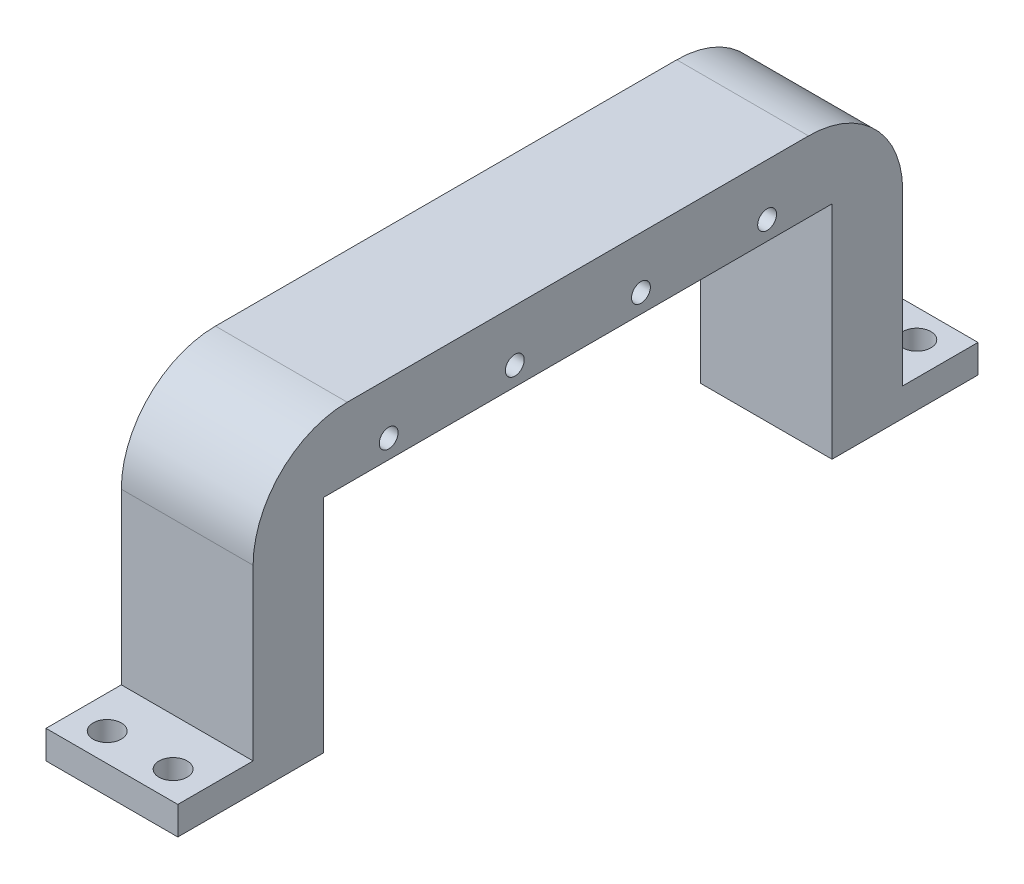
ISO-10303-21;
HEADER;
FILE_DESCRIPTION(('STEP AP214'),'2;1');
FILE_NAME('part.step','',(''),(''),'','','');
FILE_SCHEMA(('AUTOMOTIVE_DESIGN { 1 0 10303 214 1 1 1 1 }'));
ENDSEC;
DATA;
#1=APPLICATION_CONTEXT('core data for automotive mechanical design processes');
#2=APPLICATION_PROTOCOL_DEFINITION('international standard','automotive_design',2000,#1);
#3=PRODUCT_CONTEXT('',#1,'mechanical');
#4=PRODUCT('Part','Part','',(#3));
#5=PRODUCT_RELATED_PRODUCT_CATEGORY('part','',(#4));
#6=PRODUCT_DEFINITION_FORMATION('','',#4);
#7=PRODUCT_DEFINITION_CONTEXT('part definition',#1,'design');
#8=PRODUCT_DEFINITION('design','',#6,#7);
#9=PRODUCT_DEFINITION_SHAPE('','',#8);
#10=(LENGTH_UNIT() NAMED_UNIT(*) SI_UNIT(.MILLI.,.METRE.));
#11=(NAMED_UNIT(*) PLANE_ANGLE_UNIT() SI_UNIT($,.RADIAN.));
#12=(NAMED_UNIT(*) SI_UNIT($,.STERADIAN.) SOLID_ANGLE_UNIT());
#13=UNCERTAINTY_MEASURE_WITH_UNIT(LENGTH_MEASURE(1.E-05),#10,'distance_accuracy_value','');
#14=(GEOMETRIC_REPRESENTATION_CONTEXT(3) GLOBAL_UNCERTAINTY_ASSIGNED_CONTEXT((#13)) GLOBAL_UNIT_ASSIGNED_CONTEXT((#10,
#11,#12)) REPRESENTATION_CONTEXT('',''));
#15=CARTESIAN_POINT('',(0.,0.,0.));
#16=DIRECTION('',(0.,0.,1.));
#17=DIRECTION('',(1.,0.,0.));
#18=AXIS2_PLACEMENT_3D('',#15,#16,#17);
#19=CARTESIAN_POINT('',(-7.,0.,-27.));
#20=DIRECTION('',(0.,0.,1.));
#21=DIRECTION('',(0.,-1.,0.));
#22=AXIS2_PLACEMENT_3D('',#19,#20,#21);
#23=PLANE('',#22);
#24=DIRECTION('',(1.,0.,0.));
#25=VECTOR('',#24,1.);
#26=CARTESIAN_POINT('',(-7.,-23.5,-27.));
#27=LINE('',#26,#25);
#28=CARTESIAN_POINT('',(-7.,-23.5,-27.));
#29=VERTEX_POINT('',#28);
#30=CARTESIAN_POINT('',(7.,-23.5,-27.));
#31=VERTEX_POINT('',#30);
#32=EDGE_CURVE('E190',#29,#31,#27,.T.);
#33=ORIENTED_EDGE('',*,*,#32,.T.);
#34=DIRECTION('',(0.,-1.,0.));
#35=VECTOR('',#34,1.);
#36=CARTESIAN_POINT('',(7.,0.,-27.));
#37=LINE('',#36,#35);
#38=CARTESIAN_POINT('',(7.,0.,-27.));
#39=VERTEX_POINT('',#38);
#40=EDGE_CURVE('E326',#39,#31,#37,.T.);
#41=ORIENTED_EDGE('',*,*,#40,.F.);
#42=DIRECTION('',(1.,0.,0.));
#43=VECTOR('',#42,1.);
#44=CARTESIAN_POINT('',(-7.,0.,-27.));
#45=LINE('',#44,#43);
#46=CARTESIAN_POINT('',(-7.,0.,-27.));
#47=VERTEX_POINT('',#46);
#48=EDGE_CURVE('E191',#47,#39,#45,.T.);
#49=ORIENTED_EDGE('',*,*,#48,.F.);
#50=DIRECTION('',(0.,-1.,0.));
#51=VECTOR('',#50,1.);
#52=CARTESIAN_POINT('',(-7.,0.,-27.));
#53=LINE('',#52,#51);
#54=EDGE_CURVE('E175',#47,#29,#53,.T.);
#55=ORIENTED_EDGE('',*,*,#54,.T.);
#56=EDGE_LOOP('',(#33,#41,#49,#55));
#57=FACE_BOUND('',#56,.T.);
#58=ADVANCED_FACE('F48',(#57),#23,.T.);
#59=CARTESIAN_POINT('',(-7.,0.,27.));
#60=DIRECTION('',(0.,-1.,0.));
#61=DIRECTION('',(0.,0.,-1.));
#62=AXIS2_PLACEMENT_3D('',#59,#60,#61);
#63=PLANE('',#62);
#64=ORIENTED_EDGE('',*,*,#48,.T.);
#65=DIRECTION('',(0.,0.,-1.));
#66=VECTOR('',#65,1.);
#67=CARTESIAN_POINT('',(7.,0.,27.));
#68=LINE('',#67,#66);
#69=CARTESIAN_POINT('',(7.,0.,27.));
#70=VERTEX_POINT('',#69);
#71=EDGE_CURVE('E240',#70,#39,#68,.T.);
#72=ORIENTED_EDGE('',*,*,#71,.F.);
#73=DIRECTION('',(1.,0.,0.));
#74=VECTOR('',#73,1.);
#75=CARTESIAN_POINT('',(-7.,0.,27.));
#76=LINE('',#75,#74);
#77=CARTESIAN_POINT('',(-7.,0.,27.));
#78=VERTEX_POINT('',#77);
#79=EDGE_CURVE('E194',#78,#70,#76,.T.);
#80=ORIENTED_EDGE('',*,*,#79,.F.);
#81=DIRECTION('',(0.,0.,-1.));
#82=VECTOR('',#81,1.);
#83=CARTESIAN_POINT('',(-7.,0.,27.));
#84=LINE('',#83,#82);
#85=EDGE_CURVE('E187',#78,#47,#84,.T.);
#86=ORIENTED_EDGE('',*,*,#85,.T.);
#87=EDGE_LOOP('',(#64,#72,#80,#86));
#88=FACE_BOUND('',#87,.T.);
#89=ADVANCED_FACE('F251',(#88),#63,.T.);
#90=CARTESIAN_POINT('',(-7.,0.,27.));
#91=DIRECTION('',(0.,0.,-1.));
#92=DIRECTION('',(0.,1.,0.));
#93=AXIS2_PLACEMENT_3D('',#90,#91,#92);
#94=PLANE('',#93);
#95=ORIENTED_EDGE('',*,*,#79,.T.);
#96=DIRECTION('',(0.,1.,0.));
#97=VECTOR('',#96,1.);
#98=CARTESIAN_POINT('',(7.,0.,27.));
#99=LINE('',#98,#97);
#100=CARTESIAN_POINT('',(7.,-23.5,27.));
#101=VERTEX_POINT('',#100);
#102=EDGE_CURVE('E233',#101,#70,#99,.T.);
#103=ORIENTED_EDGE('',*,*,#102,.F.);
#104=DIRECTION('',(1.,0.,0.));
#105=VECTOR('',#104,1.);
#106=CARTESIAN_POINT('',(-7.,-23.5,27.));
#107=LINE('',#106,#105);
#108=CARTESIAN_POINT('',(-7.,-23.5,27.));
#109=VERTEX_POINT('',#108);
#110=EDGE_CURVE('E196',#109,#101,#107,.T.);
#111=ORIENTED_EDGE('',*,*,#110,.F.);
#112=DIRECTION('',(0.,1.,0.));
#113=VECTOR('',#112,1.);
#114=CARTESIAN_POINT('',(-7.,0.,27.));
#115=LINE('',#114,#113);
#116=EDGE_CURVE('E184',#109,#78,#115,.T.);
#117=ORIENTED_EDGE('',*,*,#116,.T.);
#118=EDGE_LOOP('',(#95,#103,#111,#117));
#119=FACE_BOUND('',#118,.T.);
#120=ADVANCED_FACE('F255',(#119),#94,.T.);
#121=CARTESIAN_POINT('',(-7.,-23.5,27.));
#122=DIRECTION('',(0.,-1.,0.));
#123=DIRECTION('',(0.,0.,-1.));
#124=AXIS2_PLACEMENT_3D('',#121,#122,#123);
#125=PLANE('',#124);
#126=CARTESIAN_POINT('',(-3.5,-23.5,30.75));
#127=DIRECTION('',(0.,-1.,0.));
#128=DIRECTION('',(0.,0.,1.));
#129=AXIS2_PLACEMENT_3D('',#126,#127,#128);
#130=CIRCLE('',#129,1.5);
#131=CARTESIAN_POINT('',(-3.5,-23.5,32.25));
#132=VERTEX_POINT('',#131);
#133=EDGE_CURVE('E284',#132,#132,#130,.T.);
#134=ORIENTED_EDGE('',*,*,#133,.F.);
#135=EDGE_LOOP('',(#134));
#136=FACE_BOUND('',#135,.T.);
#137=CARTESIAN_POINT('',(3.5,-23.5,30.75));
#138=DIRECTION('',(0.,-1.,0.));
#139=DIRECTION('',(0.,0.,-1.));
#140=AXIS2_PLACEMENT_3D('',#137,#138,#139);
#141=CIRCLE('',#140,1.5);
#142=CARTESIAN_POINT('',(3.5,-23.5,29.25));
#143=VERTEX_POINT('',#142);
#144=EDGE_CURVE('E278',#143,#143,#141,.T.);
#145=ORIENTED_EDGE('',*,*,#144,.F.);
#146=EDGE_LOOP('',(#145));
#147=FACE_BOUND('',#146,.T.);
#148=ORIENTED_EDGE('',*,*,#110,.T.);
#149=DIRECTION('',(0.,0.,-1.));
#150=VECTOR('',#149,1.);
#151=CARTESIAN_POINT('',(7.,-23.5,27.));
#152=LINE('',#151,#150);
#153=CARTESIAN_POINT('',(7.,-23.5,42.5));
#154=VERTEX_POINT('',#153);
#155=EDGE_CURVE('E230',#154,#101,#152,.T.);
#156=ORIENTED_EDGE('',*,*,#155,.F.);
#157=DIRECTION('',(-1.,0.,0.));
#158=VECTOR('',#157,1.);
#159=CARTESIAN_POINT('',(-7.,-23.5,42.5));
#160=LINE('',#159,#158);
#161=CARTESIAN_POINT('',(-7.,-23.5,42.5));
#162=VERTEX_POINT('',#161);
#163=EDGE_CURVE('E262',#154,#162,#160,.T.);
#164=ORIENTED_EDGE('',*,*,#163,.T.);
#165=DIRECTION('',(0.,0.,-1.));
#166=VECTOR('',#165,1.);
#167=CARTESIAN_POINT('',(-7.,-23.5,27.));
#168=LINE('',#167,#166);
#169=EDGE_CURVE('E181',#162,#109,#168,.T.);
#170=ORIENTED_EDGE('',*,*,#169,.T.);
#171=EDGE_LOOP('',(#148,#156,#164,#170));
#172=FACE_BOUND('',#171,.T.);
#173=CARTESIAN_POINT('',(3.5,-23.5,39.5));
#174=DIRECTION('',(0.,-1.,0.));
#175=DIRECTION('',(0.,0.,1.));
#176=AXIS2_PLACEMENT_3D('',#173,#174,#175);
#177=CIRCLE('',#176,1.5);
#178=CARTESIAN_POINT('',(3.5,-23.5,41.));
#179=VERTEX_POINT('',#178);
#180=EDGE_CURVE('E470',#179,#179,#177,.T.);
#181=ORIENTED_EDGE('',*,*,#180,.F.);
#182=EDGE_LOOP('',(#181));
#183=FACE_BOUND('',#182,.T.);
#184=CARTESIAN_POINT('',(-3.5,-23.5,39.5));
#185=DIRECTION('',(0.,-1.,0.));
#186=DIRECTION('',(0.,0.,-1.));
#187=AXIS2_PLACEMENT_3D('',#184,#185,#186);
#188=CIRCLE('',#187,1.5);
#189=CARTESIAN_POINT('',(-3.5,-23.5,38.));
#190=VERTEX_POINT('',#189);
#191=EDGE_CURVE('E270',#190,#190,#188,.T.);
#192=ORIENTED_EDGE('',*,*,#191,.F.);
#193=EDGE_LOOP('',(#192));
#194=FACE_BOUND('',#193,.T.);
#195=ADVANCED_FACE('F259',(#136,#147,#172,#183,#194),#125,.T.);
#196=CARTESIAN_POINT('',(-7.,-23.5,34.5));
#197=DIRECTION('',(0.,0.,1.));
#198=DIRECTION('',(1.,0.,0.));
#199=AXIS2_PLACEMENT_3D('',#196,#197,#198);
#200=PLANE('',#199);
#201=DIRECTION('',(1.,0.,0.));
#202=VECTOR('',#201,1.);
#203=CARTESIAN_POINT('',(-7.,-20.5,34.5));
#204=LINE('',#203,#202);
#205=CARTESIAN_POINT('',(-7.,-20.5,34.5));
#206=VERTEX_POINT('',#205);
#207=CARTESIAN_POINT('',(7.,-20.5,34.5));
#208=VERTEX_POINT('',#207);
#209=EDGE_CURVE('E229',#206,#208,#204,.T.);
#210=ORIENTED_EDGE('',*,*,#209,.T.);
#211=DIRECTION('',(0.,-1.,0.));
#212=VECTOR('',#211,1.);
#213=CARTESIAN_POINT('',(7.,-23.5,34.5));
#214=LINE('',#213,#212);
#215=CARTESIAN_POINT('',(7.,-2.50000000000001,34.5));
#216=VERTEX_POINT('',#215);
#217=EDGE_CURVE('E224',#216,#208,#214,.T.);
#218=ORIENTED_EDGE('',*,*,#217,.F.);
#219=DIRECTION('',(1.,0.,0.));
#220=VECTOR('',#219,1.);
#221=CARTESIAN_POINT('',(-7.,-2.50000000000001,34.5));
#222=LINE('',#221,#220);
#223=CARTESIAN_POINT('',(-7.,-2.50000000000001,34.5));
#224=VERTEX_POINT('',#223);
#225=EDGE_CURVE('E207',#216,#224,#222,.F.);
#226=ORIENTED_EDGE('',*,*,#225,.T.);
#227=DIRECTION('',(0.,-1.,0.));
#228=VECTOR('',#227,1.);
#229=CARTESIAN_POINT('',(-7.,-23.5,34.5));
#230=LINE('',#229,#228);
#231=EDGE_CURVE('E173',#224,#206,#230,.T.);
#232=ORIENTED_EDGE('',*,*,#231,.T.);
#233=EDGE_LOOP('',(#210,#218,#226,#232));
#234=FACE_BOUND('',#233,.T.);
#235=ADVANCED_FACE('F228',(#234),#200,.T.);
#236=CARTESIAN_POINT('',(-7.,7.49999999999999,-34.5));
#237=DIRECTION('',(0.,1.,0.));
#238=DIRECTION('',(0.,0.,1.));
#239=AXIS2_PLACEMENT_3D('',#236,#237,#238);
#240=PLANE('',#239);
#241=DIRECTION('',(0.,0.,1.));
#242=VECTOR('',#241,1.);
#243=CARTESIAN_POINT('',(-7.,7.49999999999999,-34.5));
#244=LINE('',#243,#242);
#245=CARTESIAN_POINT('',(-7.,7.49999999999999,-24.5));
#246=VERTEX_POINT('',#245);
#247=CARTESIAN_POINT('',(-7.,7.49999999999999,24.5));
#248=VERTEX_POINT('',#247);
#249=EDGE_CURVE('E169',#246,#248,#244,.T.);
#250=ORIENTED_EDGE('',*,*,#249,.T.);
#251=DIRECTION('',(1.,0.,0.));
#252=VECTOR('',#251,1.);
#253=CARTESIAN_POINT('',(-7.,7.49999999999999,24.5));
#254=LINE('',#253,#252);
#255=CARTESIAN_POINT('',(7.,7.49999999999999,24.5));
#256=VERTEX_POINT('',#255);
#257=EDGE_CURVE('E200',#248,#256,#254,.T.);
#258=ORIENTED_EDGE('',*,*,#257,.T.);
#259=DIRECTION('',(0.,0.,1.));
#260=VECTOR('',#259,1.);
#261=CARTESIAN_POINT('',(7.,7.49999999999999,-34.5));
#262=LINE('',#261,#260);
#263=CARTESIAN_POINT('',(7.,7.49999999999999,-24.5));
#264=VERTEX_POINT('',#263);
#265=EDGE_CURVE('E225',#264,#256,#262,.T.);
#266=ORIENTED_EDGE('',*,*,#265,.F.);
#267=DIRECTION('',(1.,0.,0.));
#268=VECTOR('',#267,1.);
#269=CARTESIAN_POINT('',(-7.,7.49999999999999,-24.5));
#270=LINE('',#269,#268);
#271=EDGE_CURVE('E193',#264,#246,#270,.F.);
#272=ORIENTED_EDGE('',*,*,#271,.T.);
#273=EDGE_LOOP('',(#250,#258,#266,#272));
#274=FACE_BOUND('',#273,.T.);
#275=ADVANCED_FACE('F215',(#274),#240,.T.);
#276=CARTESIAN_POINT('',(-7.,-23.5,-34.5));
#277=DIRECTION('',(0.,0.,-1.));
#278=DIRECTION('',(-1.,0.,0.));
#279=AXIS2_PLACEMENT_3D('',#276,#277,#278);
#280=PLANE('',#279);
#281=DIRECTION('',(-1.,0.,0.));
#282=VECTOR('',#281,1.);
#283=CARTESIAN_POINT('',(-7.,-20.5,-34.5));
#284=LINE('',#283,#282);
#285=CARTESIAN_POINT('',(7.,-20.5,-34.5));
#286=VERTEX_POINT('',#285);
#287=CARTESIAN_POINT('',(-7.,-20.5,-34.5));
#288=VERTEX_POINT('',#287);
#289=EDGE_CURVE('E152',#286,#288,#284,.T.);
#290=ORIENTED_EDGE('',*,*,#289,.T.);
#291=DIRECTION('',(0.,1.,0.));
#292=VECTOR('',#291,1.);
#293=CARTESIAN_POINT('',(-7.,-23.5,-34.5));
#294=LINE('',#293,#292);
#295=CARTESIAN_POINT('',(-7.,-2.50000000000001,-34.5));
#296=VERTEX_POINT('',#295);
#297=EDGE_CURVE('E70',#288,#296,#294,.T.);
#298=ORIENTED_EDGE('',*,*,#297,.T.);
#299=DIRECTION('',(1.,0.,0.));
#300=VECTOR('',#299,1.);
#301=CARTESIAN_POINT('',(-7.,-2.50000000000001,-34.5));
#302=LINE('',#301,#300);
#303=CARTESIAN_POINT('',(7.,-2.50000000000001,-34.5));
#304=VERTEX_POINT('',#303);
#305=EDGE_CURVE('E13',#296,#304,#302,.T.);
#306=ORIENTED_EDGE('',*,*,#305,.T.);
#307=DIRECTION('',(0.,1.,0.));
#308=VECTOR('',#307,1.);
#309=CARTESIAN_POINT('',(7.,-23.5,-34.5));
#310=LINE('',#309,#308);
#311=EDGE_CURVE('E160',#286,#304,#310,.T.);
#312=ORIENTED_EDGE('',*,*,#311,.F.);
#313=EDGE_LOOP('',(#290,#298,#306,#312));
#314=FACE_BOUND('',#313,.T.);
#315=ADVANCED_FACE('F159',(#314),#280,.T.);
#316=CARTESIAN_POINT('',(-7.,-23.5,-27.));
#317=DIRECTION('',(0.,-1.,0.));
#318=DIRECTION('',(0.,0.,-1.));
#319=AXIS2_PLACEMENT_3D('',#316,#317,#318);
#320=PLANE('',#319);
#321=CARTESIAN_POINT('',(3.5,-23.5,-30.75));
#322=DIRECTION('',(0.,-1.,0.));
#323=DIRECTION('',(0.,0.,1.));
#324=AXIS2_PLACEMENT_3D('',#321,#322,#323);
#325=CIRCLE('',#324,1.5);
#326=CARTESIAN_POINT('',(3.5,-23.5,-29.25));
#327=VERTEX_POINT('',#326);
#328=EDGE_CURVE('E291',#327,#327,#325,.T.);
#329=ORIENTED_EDGE('',*,*,#328,.F.);
#330=EDGE_LOOP('',(#329));
#331=FACE_BOUND('',#330,.T.);
#332=CARTESIAN_POINT('',(-3.5,-23.5,-30.75));
#333=DIRECTION('',(0.,-1.,0.));
#334=DIRECTION('',(0.,0.,-1.));
#335=AXIS2_PLACEMENT_3D('',#332,#333,#334);
#336=CIRCLE('',#335,1.5);
#337=CARTESIAN_POINT('',(-3.5,-23.5,-32.25));
#338=VERTEX_POINT('',#337);
#339=EDGE_CURVE('E290',#338,#338,#336,.T.);
#340=ORIENTED_EDGE('',*,*,#339,.F.);
#341=EDGE_LOOP('',(#340));
#342=FACE_BOUND('',#341,.T.);
#343=DIRECTION('',(0.,0.,-1.));
#344=VECTOR('',#343,1.);
#345=CARTESIAN_POINT('',(-7.,-23.5,-27.));
#346=LINE('',#345,#344);
#347=CARTESIAN_POINT('',(-7.,-23.5,-42.5));
#348=VERTEX_POINT('',#347);
#349=EDGE_CURVE('E170',#29,#348,#346,.T.);
#350=ORIENTED_EDGE('',*,*,#349,.T.);
#351=DIRECTION('',(1.,0.,0.));
#352=VECTOR('',#351,1.);
#353=CARTESIAN_POINT('',(-7.,-23.5,-42.5));
#354=LINE('',#353,#352);
#355=CARTESIAN_POINT('',(7.,-23.5,-42.5));
#356=VERTEX_POINT('',#355);
#357=EDGE_CURVE('E161',#348,#356,#354,.T.);
#358=ORIENTED_EDGE('',*,*,#357,.T.);
#359=DIRECTION('',(0.,0.,-1.));
#360=VECTOR('',#359,1.);
#361=CARTESIAN_POINT('',(7.,-23.5,-27.));
#362=LINE('',#361,#360);
#363=EDGE_CURVE('E331',#31,#356,#362,.T.);
#364=ORIENTED_EDGE('',*,*,#363,.F.);
#365=ORIENTED_EDGE('',*,*,#32,.F.);
#366=EDGE_LOOP('',(#350,#358,#364,#365));
#367=FACE_BOUND('',#366,.T.);
#368=CARTESIAN_POINT('',(-3.5,-23.5,-39.5));
#369=DIRECTION('',(0.,-1.,0.));
#370=DIRECTION('',(0.,0.,1.));
#371=AXIS2_PLACEMENT_3D('',#368,#369,#370);
#372=CIRCLE('',#371,1.5);
#373=CARTESIAN_POINT('',(-3.5,-23.5,-38.));
#374=VERTEX_POINT('',#373);
#375=EDGE_CURVE('E451',#374,#374,#372,.T.);
#376=ORIENTED_EDGE('',*,*,#375,.F.);
#377=EDGE_LOOP('',(#376));
#378=FACE_BOUND('',#377,.T.);
#379=CARTESIAN_POINT('',(3.5,-23.5,-39.5));
#380=DIRECTION('',(0.,-1.,0.));
#381=DIRECTION('',(0.,0.,-1.));
#382=AXIS2_PLACEMENT_3D('',#379,#380,#381);
#383=CIRCLE('',#382,1.5);
#384=CARTESIAN_POINT('',(3.5,-23.5,-41.));
#385=VERTEX_POINT('',#384);
#386=EDGE_CURVE('E454',#385,#385,#383,.T.);
#387=ORIENTED_EDGE('',*,*,#386,.F.);
#388=EDGE_LOOP('',(#387));
#389=FACE_BOUND('',#388,.T.);
#390=ADVANCED_FACE('F350',(#331,#342,#367,#378,#389),#320,.T.);
#391=CARTESIAN_POINT('',(-7.,0.,0.));
#392=DIRECTION('',(1.,0.,0.));
#393=DIRECTION('',(0.,0.,-1.));
#394=AXIS2_PLACEMENT_3D('',#391,#392,#393);
#395=PLANE('',#394);
#396=CARTESIAN_POINT('',(-7.,2.,20.1));
#397=DIRECTION('',(1.,0.,0.));
#398=DIRECTION('',(0.,0.,-1.));
#399=AXIS2_PLACEMENT_3D('',#396,#397,#398);
#400=CIRCLE('',#399,1.);
#401=CARTESIAN_POINT('',(-7.,2.,19.1));
#402=VERTEX_POINT('',#401);
#403=EDGE_CURVE('E311',#402,#402,#400,.T.);
#404=ORIENTED_EDGE('',*,*,#403,.T.);
#405=EDGE_LOOP('',(#404));
#406=FACE_BOUND('',#405,.T.);
#407=CARTESIAN_POINT('',(-7.,2.,-20.1));
#408=DIRECTION('',(1.,0.,0.));
#409=DIRECTION('',(0.,0.,1.));
#410=AXIS2_PLACEMENT_3D('',#407,#408,#409);
#411=CIRCLE('',#410,1.);
#412=CARTESIAN_POINT('',(-7.,2.,-19.1));
#413=VERTEX_POINT('',#412);
#414=EDGE_CURVE('E318',#413,#413,#411,.T.);
#415=ORIENTED_EDGE('',*,*,#414,.T.);
#416=EDGE_LOOP('',(#415));
#417=FACE_BOUND('',#416,.T.);
#418=CARTESIAN_POINT('',(-7.,2.,-6.7));
#419=DIRECTION('',(1.,0.,0.));
#420=DIRECTION('',(0.,0.,1.));
#421=AXIS2_PLACEMENT_3D('',#418,#419,#420);
#422=CIRCLE('',#421,1.);
#423=CARTESIAN_POINT('',(-7.,2.,-5.7));
#424=VERTEX_POINT('',#423);
#425=EDGE_CURVE('E305',#424,#424,#422,.T.);
#426=ORIENTED_EDGE('',*,*,#425,.T.);
#427=EDGE_LOOP('',(#426));
#428=FACE_BOUND('',#427,.T.);
#429=CARTESIAN_POINT('',(-7.,2.,6.7));
#430=DIRECTION('',(1.,0.,0.));
#431=DIRECTION('',(0.,0.,-1.));
#432=AXIS2_PLACEMENT_3D('',#429,#430,#431);
#433=CIRCLE('',#432,1.);
#434=CARTESIAN_POINT('',(-7.,2.,5.7));
#435=VERTEX_POINT('',#434);
#436=EDGE_CURVE('E323',#435,#435,#433,.T.);
#437=ORIENTED_EDGE('',*,*,#436,.T.);
#438=EDGE_LOOP('',(#437));
#439=FACE_BOUND('',#438,.T.);
#440=ORIENTED_EDGE('',*,*,#231,.F.);
#441=CARTESIAN_POINT('',(-7.,-2.50000000000001,24.5));
#442=DIRECTION('',(1.,0.,0.));
#443=DIRECTION('',(0.,0.,-1.));
#444=AXIS2_PLACEMENT_3D('',#441,#442,#443);
#445=CIRCLE('',#444,10.);
#446=EDGE_CURVE('E56',#224,#248,#445,.F.);
#447=ORIENTED_EDGE('',*,*,#446,.T.);
#448=ORIENTED_EDGE('',*,*,#249,.F.);
#449=CARTESIAN_POINT('',(-7.,-2.50000000000001,-24.5));
#450=DIRECTION('',(1.,0.,0.));
#451=DIRECTION('',(0.,0.,-1.));
#452=AXIS2_PLACEMENT_3D('',#449,#450,#451);
#453=CIRCLE('',#452,10.);
#454=EDGE_CURVE('E167',#246,#296,#453,.F.);
#455=ORIENTED_EDGE('',*,*,#454,.T.);
#456=ORIENTED_EDGE('',*,*,#297,.F.);
#457=DIRECTION('',(0.,0.,-1.));
#458=VECTOR('',#457,1.);
#459=CARTESIAN_POINT('',(-7.,-20.5,-34.5));
#460=LINE('',#459,#458);
#461=CARTESIAN_POINT('',(-7.,-20.5,-42.5));
#462=VERTEX_POINT('',#461);
#463=EDGE_CURVE('E150',#288,#462,#460,.T.);
#464=ORIENTED_EDGE('',*,*,#463,.T.);
#465=DIRECTION('',(0.,-1.,0.));
#466=VECTOR('',#465,1.);
#467=CARTESIAN_POINT('',(-7.,-20.5,-42.5));
#468=LINE('',#467,#466);
#469=EDGE_CURVE('E464',#462,#348,#468,.T.);
#470=ORIENTED_EDGE('',*,*,#469,.T.);
#471=ORIENTED_EDGE('',*,*,#349,.F.);
#472=ORIENTED_EDGE('',*,*,#54,.F.);
#473=ORIENTED_EDGE('',*,*,#85,.F.);
#474=ORIENTED_EDGE('',*,*,#116,.F.);
#475=ORIENTED_EDGE('',*,*,#169,.F.);
#476=DIRECTION('',(0.,-1.,0.));
#477=VECTOR('',#476,1.);
#478=CARTESIAN_POINT('',(-7.,-20.5,42.5));
#479=LINE('',#478,#477);
#480=CARTESIAN_POINT('',(-7.,-20.5,42.5));
#481=VERTEX_POINT('',#480);
#482=EDGE_CURVE('E276',#481,#162,#479,.T.);
#483=ORIENTED_EDGE('',*,*,#482,.F.);
#484=DIRECTION('',(0.,0.,-1.));
#485=VECTOR('',#484,1.);
#486=CARTESIAN_POINT('',(-7.,-20.5,34.5));
#487=LINE('',#486,#485);
#488=EDGE_CURVE('E265',#481,#206,#487,.T.);
#489=ORIENTED_EDGE('',*,*,#488,.T.);
#490=EDGE_LOOP('',(#440,#447,#448,#455,#456,#464,#470,#471,#472,#473,#474,#475,#483,#489));
#491=FACE_BOUND('',#490,.T.);
#492=ADVANCED_FACE('F164',(#406,#417,#428,#439,#491),#395,.F.);
#493=CARTESIAN_POINT('',(7.,0.,0.));
#494=DIRECTION('',(1.,0.,0.));
#495=DIRECTION('',(0.,0.,-1.));
#496=AXIS2_PLACEMENT_3D('',#493,#494,#495);
#497=PLANE('',#496);
#498=CARTESIAN_POINT('',(7.,2.,20.1));
#499=DIRECTION('',(1.,0.,0.));
#500=DIRECTION('',(0.,0.,-1.));
#501=AXIS2_PLACEMENT_3D('',#498,#499,#500);
#502=CIRCLE('',#501,1.);
#503=CARTESIAN_POINT('',(7.,2.,19.1));
#504=VERTEX_POINT('',#503);
#505=EDGE_CURVE('E315',#504,#504,#502,.T.);
#506=ORIENTED_EDGE('',*,*,#505,.F.);
#507=EDGE_LOOP('',(#506));
#508=FACE_BOUND('',#507,.T.);
#509=CARTESIAN_POINT('',(7.,2.,-20.1));
#510=DIRECTION('',(1.,0.,0.));
#511=DIRECTION('',(0.,0.,1.));
#512=AXIS2_PLACEMENT_3D('',#509,#510,#511);
#513=CIRCLE('',#512,1.);
#514=CARTESIAN_POINT('',(7.,2.,-19.1));
#515=VERTEX_POINT('',#514);
#516=EDGE_CURVE('E308',#515,#515,#513,.T.);
#517=ORIENTED_EDGE('',*,*,#516,.F.);
#518=EDGE_LOOP('',(#517));
#519=FACE_BOUND('',#518,.T.);
#520=CARTESIAN_POINT('',(7.,2.,-6.7));
#521=DIRECTION('',(1.,0.,0.));
#522=DIRECTION('',(0.,0.,1.));
#523=AXIS2_PLACEMENT_3D('',#520,#521,#522);
#524=CIRCLE('',#523,1.);
#525=CARTESIAN_POINT('',(7.,2.,-5.7));
#526=VERTEX_POINT('',#525);
#527=EDGE_CURVE('E302',#526,#526,#524,.T.);
#528=ORIENTED_EDGE('',*,*,#527,.F.);
#529=EDGE_LOOP('',(#528));
#530=FACE_BOUND('',#529,.T.);
#531=CARTESIAN_POINT('',(7.,2.,6.7));
#532=DIRECTION('',(1.,0.,0.));
#533=DIRECTION('',(0.,0.,-1.));
#534=AXIS2_PLACEMENT_3D('',#531,#532,#533);
#535=CIRCLE('',#534,1.);
#536=CARTESIAN_POINT('',(7.,2.,5.7));
#537=VERTEX_POINT('',#536);
#538=EDGE_CURVE('E314',#537,#537,#535,.T.);
#539=ORIENTED_EDGE('',*,*,#538,.F.);
#540=EDGE_LOOP('',(#539));
#541=FACE_BOUND('',#540,.T.);
#542=ORIENTED_EDGE('',*,*,#265,.T.);
#543=CARTESIAN_POINT('',(7.,-2.50000000000001,24.5));
#544=DIRECTION('',(1.,0.,0.));
#545=DIRECTION('',(0.,0.,-1.));
#546=AXIS2_PLACEMENT_3D('',#543,#544,#545);
#547=CIRCLE('',#546,10.);
#548=EDGE_CURVE('E205',#256,#216,#547,.T.);
#549=ORIENTED_EDGE('',*,*,#548,.T.);
#550=ORIENTED_EDGE('',*,*,#217,.T.);
#551=DIRECTION('',(0.,0.,1.));
#552=VECTOR('',#551,1.);
#553=CARTESIAN_POINT('',(7.,-20.5,34.5));
#554=LINE('',#553,#552);
#555=CARTESIAN_POINT('',(7.,-20.5,42.5));
#556=VERTEX_POINT('',#555);
#557=EDGE_CURVE('E479',#208,#556,#554,.T.);
#558=ORIENTED_EDGE('',*,*,#557,.T.);
#559=DIRECTION('',(0.,-1.,0.));
#560=VECTOR('',#559,1.);
#561=CARTESIAN_POINT('',(7.,-20.5,42.5));
#562=LINE('',#561,#560);
#563=EDGE_CURVE('E279',#556,#154,#562,.T.);
#564=ORIENTED_EDGE('',*,*,#563,.T.);
#565=ORIENTED_EDGE('',*,*,#155,.T.);
#566=ORIENTED_EDGE('',*,*,#102,.T.);
#567=ORIENTED_EDGE('',*,*,#71,.T.);
#568=ORIENTED_EDGE('',*,*,#40,.T.);
#569=ORIENTED_EDGE('',*,*,#363,.T.);
#570=DIRECTION('',(0.,-1.,0.));
#571=VECTOR('',#570,1.);
#572=CARTESIAN_POINT('',(7.,-20.5,-42.5));
#573=LINE('',#572,#571);
#574=CARTESIAN_POINT('',(7.,-20.5,-42.5));
#575=VERTEX_POINT('',#574);
#576=EDGE_CURVE('E467',#575,#356,#573,.T.);
#577=ORIENTED_EDGE('',*,*,#576,.F.);
#578=DIRECTION('',(0.,0.,1.));
#579=VECTOR('',#578,1.);
#580=CARTESIAN_POINT('',(7.,-20.5,-34.5));
#581=LINE('',#580,#579);
#582=EDGE_CURVE('E63',#575,#286,#581,.T.);
#583=ORIENTED_EDGE('',*,*,#582,.T.);
#584=ORIENTED_EDGE('',*,*,#311,.T.);
#585=CARTESIAN_POINT('',(7.,-2.50000000000001,-24.5));
#586=DIRECTION('',(1.,0.,0.));
#587=DIRECTION('',(0.,0.,-1.));
#588=AXIS2_PLACEMENT_3D('',#585,#586,#587);
#589=CIRCLE('',#588,10.);
#590=EDGE_CURVE('E203',#304,#264,#589,.T.);
#591=ORIENTED_EDGE('',*,*,#590,.T.);
#592=EDGE_LOOP('',(#542,#549,#550,#558,#564,#565,#566,#567,#568,#569,#577,#583,#584,#591));
#593=FACE_BOUND('',#592,.T.);
#594=ADVANCED_FACE('F222',(#508,#519,#530,#541,#593),#497,.T.);
#595=CARTESIAN_POINT('',(-7.,-2.50000000000001,24.5));
#596=DIRECTION('',(1.,0.,0.));
#597=DIRECTION('',(0.,0.,-1.));
#598=AXIS2_PLACEMENT_3D('',#595,#596,#597);
#599=CYLINDRICAL_SURFACE('',#598,10.);
#600=ORIENTED_EDGE('',*,*,#446,.F.);
#601=ORIENTED_EDGE('',*,*,#225,.F.);
#602=ORIENTED_EDGE('',*,*,#548,.F.);
#603=ORIENTED_EDGE('',*,*,#257,.F.);
#604=EDGE_LOOP('',(#600,#601,#602,#603));
#605=FACE_BOUND('',#604,.T.);
#606=ADVANCED_FACE('F219',(#605),#599,.T.);
#607=CARTESIAN_POINT('',(-7.,-2.50000000000001,-24.5));
#608=DIRECTION('',(1.,0.,0.));
#609=DIRECTION('',(0.,0.,-1.));
#610=AXIS2_PLACEMENT_3D('',#607,#608,#609);
#611=CYLINDRICAL_SURFACE('',#610,10.);
#612=ORIENTED_EDGE('',*,*,#454,.F.);
#613=ORIENTED_EDGE('',*,*,#271,.F.);
#614=ORIENTED_EDGE('',*,*,#590,.F.);
#615=ORIENTED_EDGE('',*,*,#305,.F.);
#616=EDGE_LOOP('',(#612,#613,#614,#615));
#617=FACE_BOUND('',#616,.T.);
#618=ADVANCED_FACE('F50',(#617),#611,.T.);
#619=CARTESIAN_POINT('',(-7.,2.,6.7));
#620=DIRECTION('',(1.,0.,0.));
#621=DIRECTION('',(0.,0.,-1.));
#622=AXIS2_PLACEMENT_3D('',#619,#620,#621);
#623=CYLINDRICAL_SURFACE('',#622,1.);
#624=ORIENTED_EDGE('',*,*,#436,.F.);
#625=EDGE_LOOP('',(#624));
#626=FACE_BOUND('',#625,.T.);
#627=ORIENTED_EDGE('',*,*,#538,.T.);
#628=EDGE_LOOP('',(#627));
#629=FACE_BOUND('',#628,.T.);
#630=ADVANCED_FACE('F335',(#626,#629),#623,.F.);
#631=CARTESIAN_POINT('',(-7.,2.,-6.7));
#632=DIRECTION('',(1.,0.,0.));
#633=DIRECTION('',(0.,0.,-1.));
#634=AXIS2_PLACEMENT_3D('',#631,#632,#633);
#635=CYLINDRICAL_SURFACE('',#634,1.);
#636=ORIENTED_EDGE('',*,*,#425,.F.);
#637=EDGE_LOOP('',(#636));
#638=FACE_BOUND('',#637,.T.);
#639=ORIENTED_EDGE('',*,*,#527,.T.);
#640=EDGE_LOOP('',(#639));
#641=FACE_BOUND('',#640,.T.);
#642=ADVANCED_FACE('F340',(#638,#641),#635,.F.);
#643=CARTESIAN_POINT('',(-7.,2.,-20.1));
#644=DIRECTION('',(1.,0.,0.));
#645=DIRECTION('',(0.,0.,-1.));
#646=AXIS2_PLACEMENT_3D('',#643,#644,#645);
#647=CYLINDRICAL_SURFACE('',#646,1.);
#648=ORIENTED_EDGE('',*,*,#414,.F.);
#649=EDGE_LOOP('',(#648));
#650=FACE_BOUND('',#649,.T.);
#651=ORIENTED_EDGE('',*,*,#516,.T.);
#652=EDGE_LOOP('',(#651));
#653=FACE_BOUND('',#652,.T.);
#654=ADVANCED_FACE('F371',(#650,#653),#647,.F.);
#655=CARTESIAN_POINT('',(-7.,2.,20.1));
#656=DIRECTION('',(1.,0.,0.));
#657=DIRECTION('',(0.,0.,-1.));
#658=AXIS2_PLACEMENT_3D('',#655,#656,#657);
#659=CYLINDRICAL_SURFACE('',#658,1.);
#660=ORIENTED_EDGE('',*,*,#403,.F.);
#661=EDGE_LOOP('',(#660));
#662=FACE_BOUND('',#661,.T.);
#663=ORIENTED_EDGE('',*,*,#505,.T.);
#664=EDGE_LOOP('',(#663));
#665=FACE_BOUND('',#664,.T.);
#666=ADVANCED_FACE('F374',(#662,#665),#659,.F.);
#667=CARTESIAN_POINT('',(-3.5,-18.5,-30.75));
#668=DIRECTION('',(0.,-1.,0.));
#669=DIRECTION('',(0.,0.,-1.));
#670=AXIS2_PLACEMENT_3D('',#667,#668,#669);
#671=CYLINDRICAL_SURFACE('',#670,1.5);
#672=CARTESIAN_POINT('',(-3.5,-18.5,-30.75));
#673=DIRECTION('',(0.,-1.,0.));
#674=DIRECTION('',(0.,0.,-1.));
#675=AXIS2_PLACEMENT_3D('',#672,#673,#674);
#676=CIRCLE('',#675,1.5);
#677=CARTESIAN_POINT('',(-3.5,-18.5,-32.25));
#678=VERTEX_POINT('',#677);
#679=EDGE_CURVE('E299',#678,#678,#676,.T.);
#680=ORIENTED_EDGE('',*,*,#679,.F.);
#681=EDGE_LOOP('',(#680));
#682=FACE_BOUND('',#681,.T.);
#683=ORIENTED_EDGE('',*,*,#339,.T.);
#684=EDGE_LOOP('',(#683));
#685=FACE_BOUND('',#684,.T.);
#686=ADVANCED_FACE('F378',(#682,#685),#671,.F.);
#687=CARTESIAN_POINT('',(-3.5,-18.5,-30.75));
#688=DIRECTION('',(0.,-1.,0.));
#689=DIRECTION('',(0.,0.,-1.));
#690=AXIS2_PLACEMENT_3D('',#687,#688,#689);
#691=PLANE('',#690);
#692=ORIENTED_EDGE('',*,*,#679,.T.);
#693=EDGE_LOOP('',(#692));
#694=FACE_BOUND('',#693,.T.);
#695=ADVANCED_FACE('F385',(#694),#691,.T.);
#696=CARTESIAN_POINT('',(3.5,-18.5,-30.75));
#697=DIRECTION('',(0.,-1.,0.));
#698=DIRECTION('',(0.,0.,-1.));
#699=AXIS2_PLACEMENT_3D('',#696,#697,#698);
#700=CYLINDRICAL_SURFACE('',#699,1.5);
#701=CARTESIAN_POINT('',(3.5,-18.5,-30.75));
#702=DIRECTION('',(0.,-1.,0.));
#703=DIRECTION('',(0.,0.,1.));
#704=AXIS2_PLACEMENT_3D('',#701,#702,#703);
#705=CIRCLE('',#704,1.5);
#706=CARTESIAN_POINT('',(3.5,-18.5,-29.25));
#707=VERTEX_POINT('',#706);
#708=EDGE_CURVE('E287',#707,#707,#705,.T.);
#709=ORIENTED_EDGE('',*,*,#708,.F.);
#710=EDGE_LOOP('',(#709));
#711=FACE_BOUND('',#710,.T.);
#712=ORIENTED_EDGE('',*,*,#328,.T.);
#713=EDGE_LOOP('',(#712));
#714=FACE_BOUND('',#713,.T.);
#715=ADVANCED_FACE('F389',(#711,#714),#700,.F.);
#716=CARTESIAN_POINT('',(3.5,-18.5,-30.75));
#717=DIRECTION('',(0.,1.,0.));
#718=DIRECTION('',(0.,0.,1.));
#719=AXIS2_PLACEMENT_3D('',#716,#717,#718);
#720=PLANE('',#719);
#721=ORIENTED_EDGE('',*,*,#708,.T.);
#722=EDGE_LOOP('',(#721));
#723=FACE_BOUND('',#722,.T.);
#724=ADVANCED_FACE('F403',(#723),#720,.F.);
#725=CARTESIAN_POINT('',(3.5,-18.5,30.75));
#726=DIRECTION('',(0.,-1.,0.));
#727=DIRECTION('',(0.,0.,-1.));
#728=AXIS2_PLACEMENT_3D('',#725,#726,#727);
#729=CYLINDRICAL_SURFACE('',#728,1.5);
#730=CARTESIAN_POINT('',(3.5,-18.5,30.75));
#731=DIRECTION('',(0.,-1.,0.));
#732=DIRECTION('',(0.,0.,-1.));
#733=AXIS2_PLACEMENT_3D('',#730,#731,#732);
#734=CIRCLE('',#733,1.5);
#735=CARTESIAN_POINT('',(3.5,-18.5,29.25));
#736=VERTEX_POINT('',#735);
#737=EDGE_CURVE('E281',#736,#736,#734,.T.);
#738=ORIENTED_EDGE('',*,*,#737,.F.);
#739=EDGE_LOOP('',(#738));
#740=FACE_BOUND('',#739,.T.);
#741=ORIENTED_EDGE('',*,*,#144,.T.);
#742=EDGE_LOOP('',(#741));
#743=FACE_BOUND('',#742,.T.);
#744=ADVANCED_FACE('F407',(#740,#743),#729,.F.);
#745=CARTESIAN_POINT('',(3.5,-18.5,30.75));
#746=DIRECTION('',(0.,-1.,0.));
#747=DIRECTION('',(0.,0.,-1.));
#748=AXIS2_PLACEMENT_3D('',#745,#746,#747);
#749=PLANE('',#748);
#750=ORIENTED_EDGE('',*,*,#737,.T.);
#751=EDGE_LOOP('',(#750));
#752=FACE_BOUND('',#751,.T.);
#753=ADVANCED_FACE('F395',(#752),#749,.T.);
#754=CARTESIAN_POINT('',(-3.5,-18.5,30.75));
#755=DIRECTION('',(0.,-1.,0.));
#756=DIRECTION('',(0.,0.,-1.));
#757=AXIS2_PLACEMENT_3D('',#754,#755,#756);
#758=CYLINDRICAL_SURFACE('',#757,1.5);
#759=CARTESIAN_POINT('',(-3.5,-18.5,30.75));
#760=DIRECTION('',(0.,-1.,0.));
#761=DIRECTION('',(0.,0.,1.));
#762=AXIS2_PLACEMENT_3D('',#759,#760,#761);
#763=CIRCLE('',#762,1.5);
#764=CARTESIAN_POINT('',(-3.5,-18.5,32.25));
#765=VERTEX_POINT('',#764);
#766=EDGE_CURVE('E294',#765,#765,#763,.T.);
#767=ORIENTED_EDGE('',*,*,#766,.F.);
#768=EDGE_LOOP('',(#767));
#769=FACE_BOUND('',#768,.T.);
#770=ORIENTED_EDGE('',*,*,#133,.T.);
#771=EDGE_LOOP('',(#770));
#772=FACE_BOUND('',#771,.T.);
#773=ADVANCED_FACE('F391',(#769,#772),#758,.F.);
#774=CARTESIAN_POINT('',(-3.5,-18.5,30.75));
#775=DIRECTION('',(0.,1.,0.));
#776=DIRECTION('',(0.,0.,1.));
#777=AXIS2_PLACEMENT_3D('',#774,#775,#776);
#778=PLANE('',#777);
#779=ORIENTED_EDGE('',*,*,#766,.T.);
#780=EDGE_LOOP('',(#779));
#781=FACE_BOUND('',#780,.T.);
#782=ADVANCED_FACE('F394',(#781),#778,.F.);
#783=CARTESIAN_POINT('',(-7.,-20.5,42.5));
#784=DIRECTION('',(0.,0.,1.));
#785=DIRECTION('',(1.,0.,0.));
#786=AXIS2_PLACEMENT_3D('',#783,#784,#785);
#787=PLANE('',#786);
#788=ORIENTED_EDGE('',*,*,#163,.F.);
#789=ORIENTED_EDGE('',*,*,#563,.F.);
#790=DIRECTION('',(-1.,0.,0.));
#791=VECTOR('',#790,1.);
#792=CARTESIAN_POINT('',(-7.,-20.5,42.5));
#793=LINE('',#792,#791);
#794=EDGE_CURVE('E274',#556,#481,#793,.T.);
#795=ORIENTED_EDGE('',*,*,#794,.T.);
#796=ORIENTED_EDGE('',*,*,#482,.T.);
#797=EDGE_LOOP('',(#788,#789,#795,#796));
#798=FACE_BOUND('',#797,.T.);
#799=ADVANCED_FACE('F399',(#798),#787,.T.);
#800=CARTESIAN_POINT('',(0.,-20.5,0.));
#801=DIRECTION('',(0.,1.,0.));
#802=DIRECTION('',(0.,0.,1.));
#803=AXIS2_PLACEMENT_3D('',#800,#801,#802);
#804=PLANE('',#803);
#805=CARTESIAN_POINT('',(3.5,-20.5,39.5));
#806=DIRECTION('',(0.,-1.,0.));
#807=DIRECTION('',(0.,0.,1.));
#808=AXIS2_PLACEMENT_3D('',#805,#806,#807);
#809=CIRCLE('',#808,1.5);
#810=CARTESIAN_POINT('',(3.5,-20.5,41.));
#811=VERTEX_POINT('',#810);
#812=EDGE_CURVE('E472',#811,#811,#809,.T.);
#813=ORIENTED_EDGE('',*,*,#812,.T.);
#814=EDGE_LOOP('',(#813));
#815=FACE_BOUND('',#814,.T.);
#816=CARTESIAN_POINT('',(-3.5,-20.5,39.5));
#817=DIRECTION('',(0.,-1.,0.));
#818=DIRECTION('',(0.,0.,-1.));
#819=AXIS2_PLACEMENT_3D('',#816,#817,#818);
#820=CIRCLE('',#819,1.5);
#821=CARTESIAN_POINT('',(-3.5,-20.5,38.));
#822=VERTEX_POINT('',#821);
#823=EDGE_CURVE('E266',#822,#822,#820,.T.);
#824=ORIENTED_EDGE('',*,*,#823,.T.);
#825=EDGE_LOOP('',(#824));
#826=FACE_BOUND('',#825,.T.);
#827=ORIENTED_EDGE('',*,*,#488,.F.);
#828=ORIENTED_EDGE('',*,*,#794,.F.);
#829=ORIENTED_EDGE('',*,*,#557,.F.);
#830=ORIENTED_EDGE('',*,*,#209,.F.);
#831=EDGE_LOOP('',(#827,#828,#829,#830));
#832=FACE_BOUND('',#831,.T.);
#833=ADVANCED_FACE('F417',(#815,#826,#832),#804,.T.);
#834=CARTESIAN_POINT('',(-3.5,-20.5,39.5));
#835=DIRECTION('',(0.,-1.,0.));
#836=DIRECTION('',(0.,0.,-1.));
#837=AXIS2_PLACEMENT_3D('',#834,#835,#836);
#838=CYLINDRICAL_SURFACE('',#837,1.5);
#839=ORIENTED_EDGE('',*,*,#823,.F.);
#840=EDGE_LOOP('',(#839));
#841=FACE_BOUND('',#840,.T.);
#842=ORIENTED_EDGE('',*,*,#191,.T.);
#843=EDGE_LOOP('',(#842));
#844=FACE_BOUND('',#843,.T.);
#845=ADVANCED_FACE('F420',(#841,#844),#838,.F.);
#846=CARTESIAN_POINT('',(3.5,-20.5,39.5));
#847=DIRECTION('',(0.,-1.,0.));
#848=DIRECTION('',(0.,0.,-1.));
#849=AXIS2_PLACEMENT_3D('',#846,#847,#848);
#850=CYLINDRICAL_SURFACE('',#849,1.5);
#851=ORIENTED_EDGE('',*,*,#812,.F.);
#852=EDGE_LOOP('',(#851));
#853=FACE_BOUND('',#852,.T.);
#854=ORIENTED_EDGE('',*,*,#180,.T.);
#855=EDGE_LOOP('',(#854));
#856=FACE_BOUND('',#855,.T.);
#857=ADVANCED_FACE('F424',(#853,#856),#850,.F.);
#858=CARTESIAN_POINT('',(-7.,-20.5,-42.5));
#859=DIRECTION('',(0.,0.,-1.));
#860=DIRECTION('',(-1.,0.,0.));
#861=AXIS2_PLACEMENT_3D('',#858,#859,#860);
#862=PLANE('',#861);
#863=ORIENTED_EDGE('',*,*,#357,.F.);
#864=ORIENTED_EDGE('',*,*,#469,.F.);
#865=DIRECTION('',(1.,0.,0.));
#866=VECTOR('',#865,1.);
#867=CARTESIAN_POINT('',(-7.,-20.5,-42.5));
#868=LINE('',#867,#866);
#869=EDGE_CURVE('E155',#462,#575,#868,.T.);
#870=ORIENTED_EDGE('',*,*,#869,.T.);
#871=ORIENTED_EDGE('',*,*,#576,.T.);
#872=EDGE_LOOP('',(#863,#864,#870,#871));
#873=FACE_BOUND('',#872,.T.);
#874=ADVANCED_FACE('F428',(#873),#862,.T.);
#875=CARTESIAN_POINT('',(0.,-20.5,0.));
#876=DIRECTION('',(0.,1.,0.));
#877=DIRECTION('',(0.,0.,1.));
#878=AXIS2_PLACEMENT_3D('',#875,#876,#877);
#879=PLANE('',#878);
#880=CARTESIAN_POINT('',(-3.5,-20.5,-39.5));
#881=DIRECTION('',(0.,-1.,0.));
#882=DIRECTION('',(0.,0.,1.));
#883=AXIS2_PLACEMENT_3D('',#880,#881,#882);
#884=CIRCLE('',#883,1.5);
#885=CARTESIAN_POINT('',(-3.5,-20.5,-38.));
#886=VERTEX_POINT('',#885);
#887=EDGE_CURVE('E448',#886,#886,#884,.T.);
#888=ORIENTED_EDGE('',*,*,#887,.T.);
#889=EDGE_LOOP('',(#888));
#890=FACE_BOUND('',#889,.T.);
#891=CARTESIAN_POINT('',(3.5,-20.5,-39.5));
#892=DIRECTION('',(0.,-1.,0.));
#893=DIRECTION('',(0.,0.,-1.));
#894=AXIS2_PLACEMENT_3D('',#891,#892,#893);
#895=CIRCLE('',#894,1.5);
#896=CARTESIAN_POINT('',(3.5,-20.5,-41.));
#897=VERTEX_POINT('',#896);
#898=EDGE_CURVE('E457',#897,#897,#895,.T.);
#899=ORIENTED_EDGE('',*,*,#898,.T.);
#900=EDGE_LOOP('',(#899));
#901=FACE_BOUND('',#900,.T.);
#902=ORIENTED_EDGE('',*,*,#289,.F.);
#903=ORIENTED_EDGE('',*,*,#582,.F.);
#904=ORIENTED_EDGE('',*,*,#869,.F.);
#905=ORIENTED_EDGE('',*,*,#463,.F.);
#906=EDGE_LOOP('',(#902,#903,#904,#905));
#907=FACE_BOUND('',#906,.T.);
#908=ADVANCED_FACE('F151',(#890,#901,#907),#879,.T.);
#909=CARTESIAN_POINT('',(3.5,-20.5,-39.5));
#910=DIRECTION('',(0.,-1.,0.));
#911=DIRECTION('',(0.,0.,-1.));
#912=AXIS2_PLACEMENT_3D('',#909,#910,#911);
#913=CYLINDRICAL_SURFACE('',#912,1.5);
#914=ORIENTED_EDGE('',*,*,#898,.F.);
#915=EDGE_LOOP('',(#914));
#916=FACE_BOUND('',#915,.T.);
#917=ORIENTED_EDGE('',*,*,#386,.T.);
#918=EDGE_LOOP('',(#917));
#919=FACE_BOUND('',#918,.T.);
#920=ADVANCED_FACE('F435',(#916,#919),#913,.F.);
#921=CARTESIAN_POINT('',(-3.5,-20.5,-39.5));
#922=DIRECTION('',(0.,-1.,0.));
#923=DIRECTION('',(0.,0.,-1.));
#924=AXIS2_PLACEMENT_3D('',#921,#922,#923);
#925=CYLINDRICAL_SURFACE('',#924,1.5);
#926=ORIENTED_EDGE('',*,*,#887,.F.);
#927=EDGE_LOOP('',(#926));
#928=FACE_BOUND('',#927,.T.);
#929=ORIENTED_EDGE('',*,*,#375,.T.);
#930=EDGE_LOOP('',(#929));
#931=FACE_BOUND('',#930,.T.);
#932=ADVANCED_FACE('F439',(#928,#931),#925,.F.);
#933=CLOSED_SHELL('',(#58,#89,#120,#195,#235,#275,#315,#390,#492,#594,#606,#618,#630,#642,#654,
#666,#686,#695,#715,#724,#744,#753,#773,#782,#799,#833,#845,#857,#874,#908,#920,#932));
#934=MANIFOLD_SOLID_BREP('B2',#933);
#935=ADVANCED_BREP_SHAPE_REPRESENTATION('',(#18,#934),#14);
#936=SHAPE_DEFINITION_REPRESENTATION(#9,#935);
ENDSEC;
END-ISO-10303-21;
